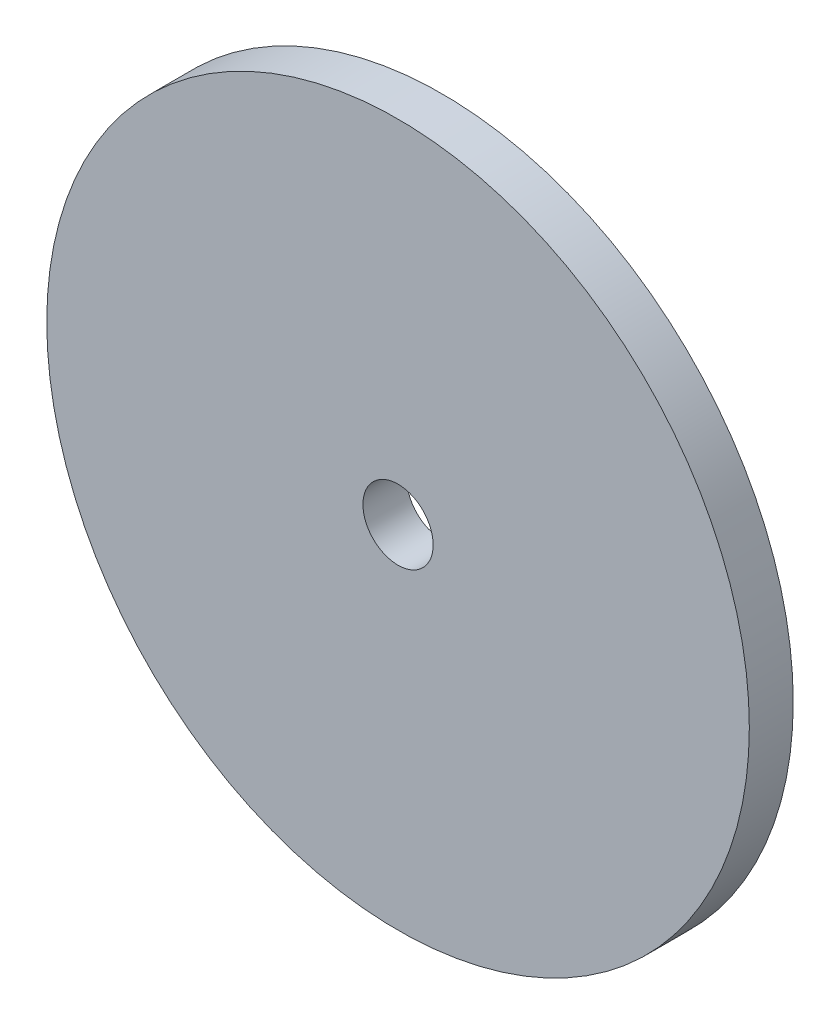
ISO-10303-21;
HEADER;
FILE_DESCRIPTION(('STEP AP214'),'2;1');
FILE_NAME('part.step','',(''),(''),'','','');
FILE_SCHEMA(('AUTOMOTIVE_DESIGN { 1 0 10303 214 1 1 1 1 }'));
ENDSEC;
DATA;
#1=APPLICATION_CONTEXT('core data for automotive mechanical design processes');
#2=APPLICATION_PROTOCOL_DEFINITION('international standard','automotive_design',2000,#1);
#3=PRODUCT_CONTEXT('',#1,'mechanical');
#4=PRODUCT('Part','Part','',(#3));
#5=PRODUCT_RELATED_PRODUCT_CATEGORY('part','',(#4));
#6=PRODUCT_DEFINITION_FORMATION('','',#4);
#7=PRODUCT_DEFINITION_CONTEXT('part definition',#1,'design');
#8=PRODUCT_DEFINITION('design','',#6,#7);
#9=PRODUCT_DEFINITION_SHAPE('','',#8);
#10=(LENGTH_UNIT() NAMED_UNIT(*) SI_UNIT(.MILLI.,.METRE.));
#11=(NAMED_UNIT(*) PLANE_ANGLE_UNIT() SI_UNIT($,.RADIAN.));
#12=(NAMED_UNIT(*) SI_UNIT($,.STERADIAN.) SOLID_ANGLE_UNIT());
#13=UNCERTAINTY_MEASURE_WITH_UNIT(LENGTH_MEASURE(1.E-05),#10,'distance_accuracy_value','');
#14=(GEOMETRIC_REPRESENTATION_CONTEXT(3) GLOBAL_UNCERTAINTY_ASSIGNED_CONTEXT((#13)) GLOBAL_UNIT_ASSIGNED_CONTEXT((#10,
#11,#12)) REPRESENTATION_CONTEXT('',''));
#15=CARTESIAN_POINT('',(0.,0.,0.));
#16=DIRECTION('',(0.,0.,1.));
#17=DIRECTION('',(1.,0.,0.));
#18=AXIS2_PLACEMENT_3D('',#15,#16,#17);
#19=CARTESIAN_POINT('',(0.,0.,5.));
#20=DIRECTION('',(0.,0.,1.));
#21=DIRECTION('',(1.,0.,0.));
#22=AXIS2_PLACEMENT_3D('',#19,#20,#21);
#23=PLANE('',#22);
#24=CARTESIAN_POINT('',(0.,0.,5.));
#25=DIRECTION('',(0.,0.,1.));
#26=DIRECTION('',(1.,0.,0.));
#27=AXIS2_PLACEMENT_3D('',#24,#25,#26);
#28=CIRCLE('',#27,40.);
#29=CARTESIAN_POINT('',(40.,0.,5.));
#30=VERTEX_POINT('',#29);
#31=EDGE_CURVE('E10',#30,#30,#28,.T.);
#32=ORIENTED_EDGE('',*,*,#31,.T.);
#33=EDGE_LOOP('',(#32));
#34=FACE_BOUND('',#33,.T.);
#35=CARTESIAN_POINT('',(0.,0.,5.));
#36=DIRECTION('',(0.,0.,1.));
#37=DIRECTION('',(1.,0.,0.));
#38=AXIS2_PLACEMENT_3D('',#35,#36,#37);
#39=CIRCLE('',#38,4.);
#40=CARTESIAN_POINT('',(4.,0.,5.));
#41=VERTEX_POINT('',#40);
#42=EDGE_CURVE('E52',#41,#41,#39,.T.);
#43=ORIENTED_EDGE('',*,*,#42,.F.);
#44=EDGE_LOOP('',(#43));
#45=FACE_BOUND('',#44,.T.);
#46=ADVANCED_FACE('F38',(#34,#45),#23,.T.);
#47=CARTESIAN_POINT('',(0.,0.,0.));
#48=DIRECTION('',(0.,0.,1.));
#49=DIRECTION('',(1.,0.,0.));
#50=AXIS2_PLACEMENT_3D('',#47,#48,#49);
#51=PLANE('',#50);
#52=CARTESIAN_POINT('',(0.,0.,0.));
#53=DIRECTION('',(0.,0.,1.));
#54=DIRECTION('',(1.,0.,0.));
#55=AXIS2_PLACEMENT_3D('',#52,#53,#54);
#56=CIRCLE('',#55,40.);
#57=CARTESIAN_POINT('',(40.,0.,0.));
#58=VERTEX_POINT('',#57);
#59=EDGE_CURVE('E42',#58,#58,#56,.T.);
#60=ORIENTED_EDGE('',*,*,#59,.F.);
#61=EDGE_LOOP('',(#60));
#62=FACE_BOUND('',#61,.T.);
#63=CARTESIAN_POINT('',(0.,0.,0.));
#64=DIRECTION('',(0.,0.,1.));
#65=DIRECTION('',(1.,0.,0.));
#66=AXIS2_PLACEMENT_3D('',#63,#64,#65);
#67=CIRCLE('',#66,4.);
#68=CARTESIAN_POINT('',(4.,0.,0.));
#69=VERTEX_POINT('',#68);
#70=EDGE_CURVE('E54',#69,#69,#67,.T.);
#71=ORIENTED_EDGE('',*,*,#70,.T.);
#72=EDGE_LOOP('',(#71));
#73=FACE_BOUND('',#72,.T.);
#74=ADVANCED_FACE('F67',(#62,#73),#51,.F.);
#75=CARTESIAN_POINT('',(0.,0.,5.));
#76=DIRECTION('',(0.,0.,-1.));
#77=DIRECTION('',(-1.,0.,0.));
#78=AXIS2_PLACEMENT_3D('',#75,#76,#77);
#79=CYLINDRICAL_SURFACE('',#78,40.);
#80=ORIENTED_EDGE('',*,*,#31,.F.);
#81=EDGE_LOOP('',(#80));
#82=FACE_BOUND('',#81,.T.);
#83=ORIENTED_EDGE('',*,*,#59,.T.);
#84=EDGE_LOOP('',(#83));
#85=FACE_BOUND('',#84,.T.);
#86=ADVANCED_FACE('F40',(#82,#85),#79,.T.);
#87=CARTESIAN_POINT('',(0.,0.,5.));
#88=DIRECTION('',(0.,0.,-1.));
#89=DIRECTION('',(-1.,0.,0.));
#90=AXIS2_PLACEMENT_3D('',#87,#88,#89);
#91=CYLINDRICAL_SURFACE('',#90,4.);
#92=ORIENTED_EDGE('',*,*,#42,.T.);
#93=EDGE_LOOP('',(#92));
#94=FACE_BOUND('',#93,.T.);
#95=ORIENTED_EDGE('',*,*,#70,.F.);
#96=EDGE_LOOP('',(#95));
#97=FACE_BOUND('',#96,.T.);
#98=ADVANCED_FACE('F63',(#94,#97),#91,.F.);
#99=CLOSED_SHELL('',(#46,#74,#86,#98));
#100=MANIFOLD_SOLID_BREP('B2',#99);
#101=ADVANCED_BREP_SHAPE_REPRESENTATION('',(#18,#100),#14);
#102=SHAPE_DEFINITION_REPRESENTATION(#9,#101);
ENDSEC;
END-ISO-10303-21;
